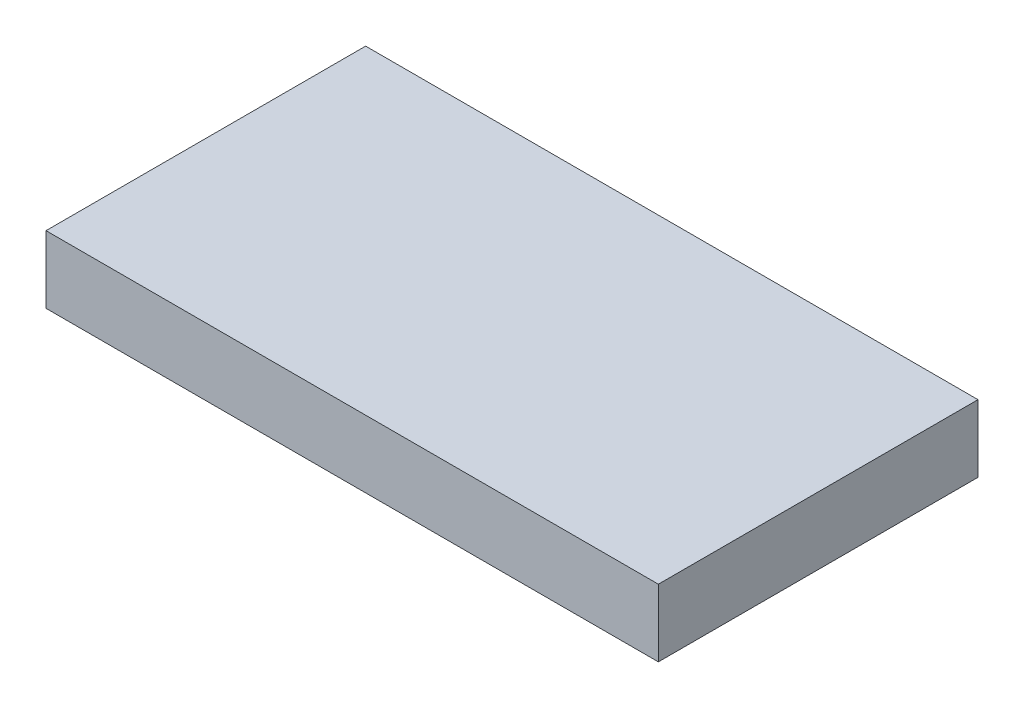
ISO-10303-21;
HEADER;
FILE_DESCRIPTION(('STEP AP214'),'2;1');
FILE_NAME('part.step','',(''),(''),'','','');
FILE_SCHEMA(('AUTOMOTIVE_DESIGN { 1 0 10303 214 1 1 1 1 }'));
ENDSEC;
DATA;
#1=APPLICATION_CONTEXT('core data for automotive mechanical design processes');
#2=APPLICATION_PROTOCOL_DEFINITION('international standard','automotive_design',2000,#1);
#3=PRODUCT_CONTEXT('',#1,'mechanical');
#4=PRODUCT('Part','Part','',(#3));
#5=PRODUCT_RELATED_PRODUCT_CATEGORY('part','',(#4));
#6=PRODUCT_DEFINITION_FORMATION('','',#4);
#7=PRODUCT_DEFINITION_CONTEXT('part definition',#1,'design');
#8=PRODUCT_DEFINITION('design','',#6,#7);
#9=PRODUCT_DEFINITION_SHAPE('','',#8);
#10=(LENGTH_UNIT() NAMED_UNIT(*) SI_UNIT(.MILLI.,.METRE.));
#11=(NAMED_UNIT(*) PLANE_ANGLE_UNIT() SI_UNIT($,.RADIAN.));
#12=(NAMED_UNIT(*) SI_UNIT($,.STERADIAN.) SOLID_ANGLE_UNIT());
#13=UNCERTAINTY_MEASURE_WITH_UNIT(LENGTH_MEASURE(1.E-05),#10,'distance_accuracy_value','');
#14=(GEOMETRIC_REPRESENTATION_CONTEXT(3) GLOBAL_UNCERTAINTY_ASSIGNED_CONTEXT((#13)) GLOBAL_UNIT_ASSIGNED_CONTEXT((#10,
#11,#12)) REPRESENTATION_CONTEXT('',''));
#15=CARTESIAN_POINT('',(0.,0.,0.));
#16=DIRECTION('',(0.,0.,1.));
#17=DIRECTION('',(1.,0.,0.));
#18=AXIS2_PLACEMENT_3D('',#15,#16,#17);
#19=CARTESIAN_POINT('',(0.,3.705,0.));
#20=DIRECTION('',(0.,1.,0.));
#21=DIRECTION('',(1.,0.,0.));
#22=AXIS2_PLACEMENT_3D('',#19,#20,#21);
#23=PLANE('',#22);
#24=DIRECTION('',(1.,0.,0.));
#25=VECTOR('',#24,1.);
#26=CARTESIAN_POINT('',(0.,3.705,-3.039));
#27=LINE('',#26,#25);
#28=CARTESIAN_POINT('',(-15.098,3.705,-3.039));
#29=VERTEX_POINT('',#28);
#30=CARTESIAN_POINT('',(-11.458,3.705,-3.039));
#31=VERTEX_POINT('',#30);
#32=EDGE_CURVE('E11',#29,#31,#27,.T.);
#33=ORIENTED_EDGE('',*,*,#32,.T.);
#34=DIRECTION('',(0.,0.,-1.));
#35=VECTOR('',#34,1.);
#36=CARTESIAN_POINT('',(-11.458,3.705,0.));
#37=LINE('',#36,#35);
#38=CARTESIAN_POINT('',(-11.458,3.705,-4.939));
#39=VERTEX_POINT('',#38);
#40=EDGE_CURVE('E24',#31,#39,#37,.T.);
#41=ORIENTED_EDGE('',*,*,#40,.T.);
#42=DIRECTION('',(-1.,0.,0.));
#43=VECTOR('',#42,1.);
#44=CARTESIAN_POINT('',(0.,3.705,-4.939));
#45=LINE('',#44,#43);
#46=CARTESIAN_POINT('',(-15.098,3.705,-4.939));
#47=VERTEX_POINT('',#46);
#48=EDGE_CURVE('E88',#39,#47,#45,.T.);
#49=ORIENTED_EDGE('',*,*,#48,.T.);
#50=DIRECTION('',(0.,0.,1.));
#51=VECTOR('',#50,1.);
#52=CARTESIAN_POINT('',(-15.098,3.705,0.));
#53=LINE('',#52,#51);
#54=EDGE_CURVE('E59',#47,#29,#53,.T.);
#55=ORIENTED_EDGE('',*,*,#54,.T.);
#56=EDGE_LOOP('',(#33,#41,#49,#55));
#57=FACE_BOUND('',#56,.T.);
#58=ADVANCED_FACE('F17',(#57),#23,.T.);
#59=CARTESIAN_POINT('',(-11.458,3.705,-3.039));
#60=DIRECTION('',(-1.,0.,0.));
#61=DIRECTION('',(0.,0.,1.));
#62=AXIS2_PLACEMENT_3D('',#59,#60,#61);
#63=PLANE('',#62);
#64=DIRECTION('',(0.,-1.,0.));
#65=VECTOR('',#64,1.);
#66=CARTESIAN_POINT('',(-11.458,3.705,-4.939));
#67=LINE('',#66,#65);
#68=CARTESIAN_POINT('',(-11.458,3.305,-4.939));
#69=VERTEX_POINT('',#68);
#70=EDGE_CURVE('E75',#39,#69,#67,.T.);
#71=ORIENTED_EDGE('',*,*,#70,.F.);
#72=ORIENTED_EDGE('',*,*,#40,.F.);
#73=DIRECTION('',(0.,1.,0.));
#74=VECTOR('',#73,1.);
#75=CARTESIAN_POINT('',(-11.458,3.705,-3.039));
#76=LINE('',#75,#74);
#77=CARTESIAN_POINT('',(-11.458,3.305,-3.039));
#78=VERTEX_POINT('',#77);
#79=EDGE_CURVE('E84',#78,#31,#76,.T.);
#80=ORIENTED_EDGE('',*,*,#79,.F.);
#81=DIRECTION('',(0.,0.,1.));
#82=VECTOR('',#81,1.);
#83=CARTESIAN_POINT('',(-11.458,3.305,-3.039));
#84=LINE('',#83,#82);
#85=EDGE_CURVE('E82',#69,#78,#84,.T.);
#86=ORIENTED_EDGE('',*,*,#85,.F.);
#87=EDGE_LOOP('',(#71,#72,#80,#86));
#88=FACE_BOUND('',#87,.T.);
#89=ADVANCED_FACE('F90',(#88),#63,.F.);
#90=CARTESIAN_POINT('',(-15.098,3.705,-3.039));
#91=DIRECTION('',(0.,0.,-1.));
#92=DIRECTION('',(0.,-1.,0.));
#93=AXIS2_PLACEMENT_3D('',#90,#91,#92);
#94=PLANE('',#93);
#95=ORIENTED_EDGE('',*,*,#79,.T.);
#96=ORIENTED_EDGE('',*,*,#32,.F.);
#97=DIRECTION('',(0.,1.,0.));
#98=VECTOR('',#97,1.);
#99=CARTESIAN_POINT('',(-15.098,3.705,-3.039));
#100=LINE('',#99,#98);
#101=CARTESIAN_POINT('',(-15.098,3.305,-3.039));
#102=VERTEX_POINT('',#101);
#103=EDGE_CURVE('E80',#102,#29,#100,.T.);
#104=ORIENTED_EDGE('',*,*,#103,.F.);
#105=DIRECTION('',(-1.,0.,0.));
#106=VECTOR('',#105,1.);
#107=CARTESIAN_POINT('',(-15.098,3.305,-3.039));
#108=LINE('',#107,#106);
#109=EDGE_CURVE('E63',#78,#102,#108,.T.);
#110=ORIENTED_EDGE('',*,*,#109,.F.);
#111=EDGE_LOOP('',(#95,#96,#104,#110));
#112=FACE_BOUND('',#111,.T.);
#113=ADVANCED_FACE('F91',(#112),#94,.F.);
#114=CARTESIAN_POINT('',(-15.098,3.705,-4.939));
#115=DIRECTION('',(1.,0.,0.));
#116=DIRECTION('',(0.,0.,1.));
#117=AXIS2_PLACEMENT_3D('',#114,#115,#116);
#118=PLANE('',#117);
#119=ORIENTED_EDGE('',*,*,#103,.T.);
#120=ORIENTED_EDGE('',*,*,#54,.F.);
#121=DIRECTION('',(0.,1.,0.));
#122=VECTOR('',#121,1.);
#123=CARTESIAN_POINT('',(-15.098,3.705,-4.939));
#124=LINE('',#123,#122);
#125=CARTESIAN_POINT('',(-15.098,3.305,-4.939));
#126=VERTEX_POINT('',#125);
#127=EDGE_CURVE('E54',#126,#47,#124,.T.);
#128=ORIENTED_EDGE('',*,*,#127,.F.);
#129=DIRECTION('',(0.,0.,-1.));
#130=VECTOR('',#129,1.);
#131=CARTESIAN_POINT('',(-15.098,3.305,-4.939));
#132=LINE('',#131,#130);
#133=EDGE_CURVE('E58',#102,#126,#132,.T.);
#134=ORIENTED_EDGE('',*,*,#133,.F.);
#135=EDGE_LOOP('',(#119,#120,#128,#134));
#136=FACE_BOUND('',#135,.T.);
#137=ADVANCED_FACE('F57',(#136),#118,.F.);
#138=CARTESIAN_POINT('',(-11.458,3.705,-4.939));
#139=DIRECTION('',(0.,0.,1.));
#140=DIRECTION('',(1.,0.,0.));
#141=AXIS2_PLACEMENT_3D('',#138,#139,#140);
#142=PLANE('',#141);
#143=ORIENTED_EDGE('',*,*,#127,.T.);
#144=ORIENTED_EDGE('',*,*,#48,.F.);
#145=ORIENTED_EDGE('',*,*,#70,.T.);
#146=DIRECTION('',(1.,0.,0.));
#147=VECTOR('',#146,1.);
#148=CARTESIAN_POINT('',(-11.458,3.305,-4.939));
#149=LINE('',#148,#147);
#150=EDGE_CURVE('E70',#126,#69,#149,.T.);
#151=ORIENTED_EDGE('',*,*,#150,.F.);
#152=EDGE_LOOP('',(#143,#144,#145,#151));
#153=FACE_BOUND('',#152,.T.);
#154=ADVANCED_FACE('F73',(#153),#142,.F.);
#155=CARTESIAN_POINT('',(0.,3.305,0.));
#156=DIRECTION('',(0.,1.,0.));
#157=DIRECTION('',(1.,0.,0.));
#158=AXIS2_PLACEMENT_3D('',#155,#156,#157);
#159=PLANE('',#158);
#160=ORIENTED_EDGE('',*,*,#85,.T.);
#161=ORIENTED_EDGE('',*,*,#109,.T.);
#162=ORIENTED_EDGE('',*,*,#133,.T.);
#163=ORIENTED_EDGE('',*,*,#150,.T.);
#164=EDGE_LOOP('',(#160,#161,#162,#163));
#165=FACE_BOUND('',#164,.T.);
#166=ADVANCED_FACE('F69',(#165),#159,.F.);
#167=CLOSED_SHELL('',(#58,#89,#113,#137,#154,#166));
#168=MANIFOLD_SOLID_BREP('B1',#167);
#169=ADVANCED_BREP_SHAPE_REPRESENTATION('',(#18,#168),#14);
#170=SHAPE_DEFINITION_REPRESENTATION(#9,#169);
ENDSEC;
END-ISO-10303-21;
